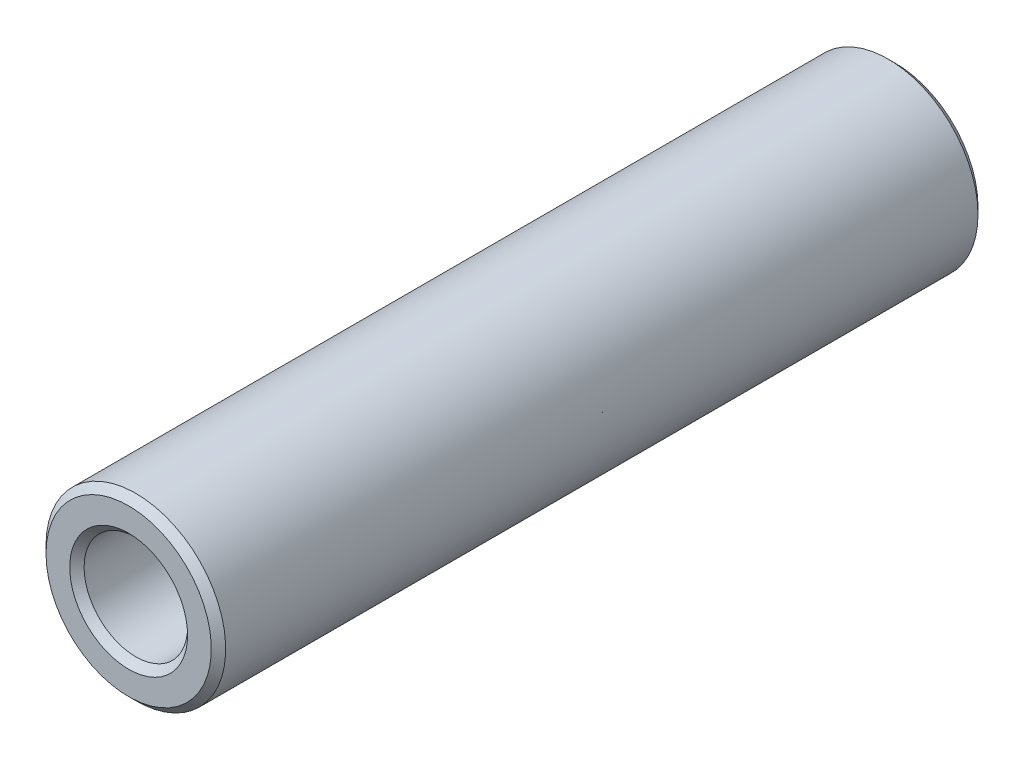
ISO-10303-21;
HEADER;
FILE_DESCRIPTION(('STEP AP214'),'2;1');
FILE_NAME('part.step','',(''),(''),'','','');
FILE_SCHEMA(('AUTOMOTIVE_DESIGN { 1 0 10303 214 1 1 1 1 }'));
ENDSEC;
DATA;
#1=APPLICATION_CONTEXT('core data for automotive mechanical design processes');
#2=APPLICATION_PROTOCOL_DEFINITION('international standard','automotive_design',2000,#1);
#3=PRODUCT_CONTEXT('',#1,'mechanical');
#4=PRODUCT('Part','Part','',(#3));
#5=PRODUCT_RELATED_PRODUCT_CATEGORY('part','',(#4));
#6=PRODUCT_DEFINITION_FORMATION('','',#4);
#7=PRODUCT_DEFINITION_CONTEXT('part definition',#1,'design');
#8=PRODUCT_DEFINITION('design','',#6,#7);
#9=PRODUCT_DEFINITION_SHAPE('','',#8);
#10=(LENGTH_UNIT() NAMED_UNIT(*) SI_UNIT(.MILLI.,.METRE.));
#11=(NAMED_UNIT(*) PLANE_ANGLE_UNIT() SI_UNIT($,.RADIAN.));
#12=(NAMED_UNIT(*) SI_UNIT($,.STERADIAN.) SOLID_ANGLE_UNIT());
#13=UNCERTAINTY_MEASURE_WITH_UNIT(LENGTH_MEASURE(1.E-05),#10,'distance_accuracy_value','');
#14=(GEOMETRIC_REPRESENTATION_CONTEXT(3) GLOBAL_UNCERTAINTY_ASSIGNED_CONTEXT((#13)) GLOBAL_UNIT_ASSIGNED_CONTEXT((#10,
#11,#12)) REPRESENTATION_CONTEXT('',''));
#15=CARTESIAN_POINT('',(0.,0.,0.));
#16=DIRECTION('',(0.,0.,1.));
#17=DIRECTION('',(1.,0.,0.));
#18=AXIS2_PLACEMENT_3D('',#15,#16,#17);
#19=CARTESIAN_POINT('',(0.,0.,0.));
#20=DIRECTION('',(0.,0.,-1.));
#21=DIRECTION('',(-1.,0.,0.));
#22=AXIS2_PLACEMENT_3D('',#19,#20,#21);
#23=CYLINDRICAL_SURFACE('',#22,2.7432);
#24=CARTESIAN_POINT('',(0.,0.,40.2589999999918));
#25=DIRECTION('',(0.,0.,1.));
#26=DIRECTION('',(1.,0.,0.));
#27=AXIS2_PLACEMENT_3D('',#24,#25,#26);
#28=CIRCLE('',#27,2.74319999999761);
#29=CARTESIAN_POINT('',(2.74319999999761,0.,40.2589999999918));
#30=VERTEX_POINT('',#29);
#31=EDGE_CURVE('E30',#30,#30,#28,.T.);
#32=ORIENTED_EDGE('',*,*,#31,.T.);
#33=EDGE_LOOP('',(#32));
#34=FACE_BOUND('',#33,.T.);
#35=CARTESIAN_POINT('',(0.,0.,0.381000000061249));
#36=DIRECTION('',(0.,0.,-1.));
#37=DIRECTION('',(-1.,0.,0.));
#38=AXIS2_PLACEMENT_3D('',#35,#36,#37);
#39=CIRCLE('',#38,2.74319999994078);
#40=CARTESIAN_POINT('',(-2.74319999994077,0.,0.381000000061249));
#41=VERTEX_POINT('',#40);
#42=EDGE_CURVE('E33',#41,#41,#39,.T.);
#43=ORIENTED_EDGE('',*,*,#42,.T.);
#44=EDGE_LOOP('',(#43));
#45=FACE_BOUND('',#44,.T.);
#46=ADVANCED_FACE('F15',(#34,#45),#23,.F.);
#47=CARTESIAN_POINT('',(0.,0.,5.6843418860808E-11));
#48=DIRECTION('',(0.,0.,-1.));
#49=DIRECTION('',(-1.,0.,0.));
#50=AXIS2_PLACEMENT_3D('',#47,#48,#49);
#51=CONICAL_SURFACE('',#50,3.12419999994518,0.785398163397448);
#52=ORIENTED_EDGE('',*,*,#42,.F.);
#53=EDGE_LOOP('',(#52));
#54=FACE_BOUND('',#53,.T.);
#55=CARTESIAN_POINT('',(0.,0.,0.));
#56=DIRECTION('',(0.,0.,-1.));
#57=DIRECTION('',(-1.,0.,0.));
#58=AXIS2_PLACEMENT_3D('',#55,#56,#57);
#59=CIRCLE('',#58,3.12420000000203);
#60=CARTESIAN_POINT('',(-3.12420000000202,0.,0.));
#61=VERTEX_POINT('',#60);
#62=EDGE_CURVE('E18',#61,#61,#59,.F.);
#63=ORIENTED_EDGE('',*,*,#62,.F.);
#64=EDGE_LOOP('',(#63));
#65=FACE_BOUND('',#64,.T.);
#66=ADVANCED_FACE('F49',(#54,#65),#51,.F.);
#67=CARTESIAN_POINT('',(0.,0.,40.6399999999962));
#68=DIRECTION('',(0.,0.,1.));
#69=DIRECTION('',(1.,0.,0.));
#70=AXIS2_PLACEMENT_3D('',#67,#68,#69);
#71=CONICAL_SURFACE('',#70,3.12419999994517,0.785398163322851);
#72=CARTESIAN_POINT('',(0.,0.,40.6399999999962));
#73=DIRECTION('',(0.,0.,1.));
#74=DIRECTION('',(1.,0.,0.));
#75=AXIS2_PLACEMENT_3D('',#72,#73,#74);
#76=CIRCLE('',#75,3.12419999994517);
#77=CARTESIAN_POINT('',(3.12419999994518,0.,40.6399999999962));
#78=VERTEX_POINT('',#77);
#79=EDGE_CURVE('E40',#78,#78,#76,.T.);
#80=ORIENTED_EDGE('',*,*,#79,.T.);
#81=EDGE_LOOP('',(#80));
#82=FACE_BOUND('',#81,.T.);
#83=ORIENTED_EDGE('',*,*,#31,.F.);
#84=EDGE_LOOP('',(#83));
#85=FACE_BOUND('',#84,.T.);
#86=ADVANCED_FACE('F51',(#82,#85),#71,.F.);
#87=CARTESIAN_POINT('',(0.,0.,0.));
#88=DIRECTION('',(0.,0.,-1.));
#89=DIRECTION('',(-1.,0.,0.));
#90=AXIS2_PLACEMENT_3D('',#87,#88,#89);
#91=PLANE('',#90);
#92=CARTESIAN_POINT('',(0.,0.,5.6843418860808E-11));
#93=DIRECTION('',(0.,0.,1.));
#94=DIRECTION('',(1.,0.,0.));
#95=AXIS2_PLACEMENT_3D('',#92,#93,#94);
#96=CIRCLE('',#95,4.38150000002224);
#97=CARTESIAN_POINT('',(4.38150000002224,0.,5.6843418860808E-11));
#98=VERTEX_POINT('',#97);
#99=EDGE_CURVE('E38',#98,#98,#96,.T.);
#100=ORIENTED_EDGE('',*,*,#99,.F.);
#101=EDGE_LOOP('',(#100));
#102=FACE_BOUND('',#101,.T.);
#103=ORIENTED_EDGE('',*,*,#62,.T.);
#104=EDGE_LOOP('',(#103));
#105=FACE_BOUND('',#104,.T.);
#106=ADVANCED_FACE('F47',(#102,#105),#91,.T.);
#107=CARTESIAN_POINT('',(0.,0.,40.64));
#108=DIRECTION('',(0.,0.,-1.));
#109=DIRECTION('',(-1.,0.,0.));
#110=AXIS2_PLACEMENT_3D('',#107,#108,#109);
#111=PLANE('',#110);
#112=CARTESIAN_POINT('',(0.,0.,40.6399999999962));
#113=DIRECTION('',(0.,0.,-1.));
#114=DIRECTION('',(-1.,0.,0.));
#115=AXIS2_PLACEMENT_3D('',#112,#113,#114);
#116=CIRCLE('',#115,4.38149999996541);
#117=CARTESIAN_POINT('',(-4.3814999999654,0.,40.6399999999962));
#118=VERTEX_POINT('',#117);
#119=EDGE_CURVE('E27',#118,#118,#116,.T.);
#120=ORIENTED_EDGE('',*,*,#119,.F.);
#121=EDGE_LOOP('',(#120));
#122=FACE_BOUND('',#121,.T.);
#123=ORIENTED_EDGE('',*,*,#79,.F.);
#124=EDGE_LOOP('',(#123));
#125=FACE_BOUND('',#124,.T.);
#126=ADVANCED_FACE('F75',(#122,#125),#111,.F.);
#127=CARTESIAN_POINT('',(0.,0.,0.381000000004406));
#128=DIRECTION('',(0.,0.,1.));
#129=DIRECTION('',(1.,0.,0.));
#130=AXIS2_PLACEMENT_3D('',#127,#128,#129);
#131=CONICAL_SURFACE('',#130,4.7624999999698,0.785398163397448);
#132=CARTESIAN_POINT('',(0.,0.,0.381));
#133=DIRECTION('',(0.,0.,-1.));
#134=DIRECTION('',(-1.,0.,0.));
#135=AXIS2_PLACEMENT_3D('',#132,#133,#134);
#136=CIRCLE('',#135,4.7625);
#137=CARTESIAN_POINT('',(-4.76249999999999,0.,0.381));
#138=VERTEX_POINT('',#137);
#139=EDGE_CURVE('E22',#138,#138,#136,.F.);
#140=ORIENTED_EDGE('',*,*,#139,.F.);
#141=EDGE_LOOP('',(#140));
#142=FACE_BOUND('',#141,.T.);
#143=ORIENTED_EDGE('',*,*,#99,.T.);
#144=EDGE_LOOP('',(#143));
#145=FACE_BOUND('',#144,.T.);
#146=ADVANCED_FACE('F68',(#142,#145),#131,.T.);
#147=CARTESIAN_POINT('',(0.,0.,40.258999999935));
#148=DIRECTION('',(0.,0.,-1.));
#149=DIRECTION('',(-1.,0.,0.));
#150=AXIS2_PLACEMENT_3D('',#147,#148,#149);
#151=CONICAL_SURFACE('',#150,4.76250000002666,0.785398163397448);
#152=CARTESIAN_POINT('',(0.,0.,40.259));
#153=DIRECTION('',(0.,0.,-1.));
#154=DIRECTION('',(-1.,0.,0.));
#155=AXIS2_PLACEMENT_3D('',#152,#153,#154);
#156=CIRCLE('',#155,4.7625);
#157=CARTESIAN_POINT('',(-4.76249999999999,0.,40.259));
#158=VERTEX_POINT('',#157);
#159=EDGE_CURVE('E10',#158,#158,#156,.T.);
#160=ORIENTED_EDGE('',*,*,#159,.F.);
#161=EDGE_LOOP('',(#160));
#162=FACE_BOUND('',#161,.T.);
#163=ORIENTED_EDGE('',*,*,#119,.T.);
#164=EDGE_LOOP('',(#163));
#165=FACE_BOUND('',#164,.T.);
#166=ADVANCED_FACE('F63',(#162,#165),#151,.T.);
#167=CARTESIAN_POINT('',(0.,0.,0.));
#168=DIRECTION('',(0.,0.,-1.));
#169=DIRECTION('',(-1.,0.,0.));
#170=AXIS2_PLACEMENT_3D('',#167,#168,#169);
#171=CYLINDRICAL_SURFACE('',#170,4.7625);
#172=ORIENTED_EDGE('',*,*,#159,.T.);
#173=EDGE_LOOP('',(#172));
#174=FACE_BOUND('',#173,.T.);
#175=ORIENTED_EDGE('',*,*,#139,.T.);
#176=EDGE_LOOP('',(#175));
#177=FACE_BOUND('',#176,.T.);
#178=ADVANCED_FACE('F61',(#174,#177),#171,.T.);
#179=CLOSED_SHELL('',(#46,#66,#86,#106,#126,#146,#166,#178));
#180=MANIFOLD_SOLID_BREP('B1',#179);
#181=ADVANCED_BREP_SHAPE_REPRESENTATION('',(#18,#180),#14);
#182=SHAPE_DEFINITION_REPRESENTATION(#9,#181);
ENDSEC;
END-ISO-10303-21;
